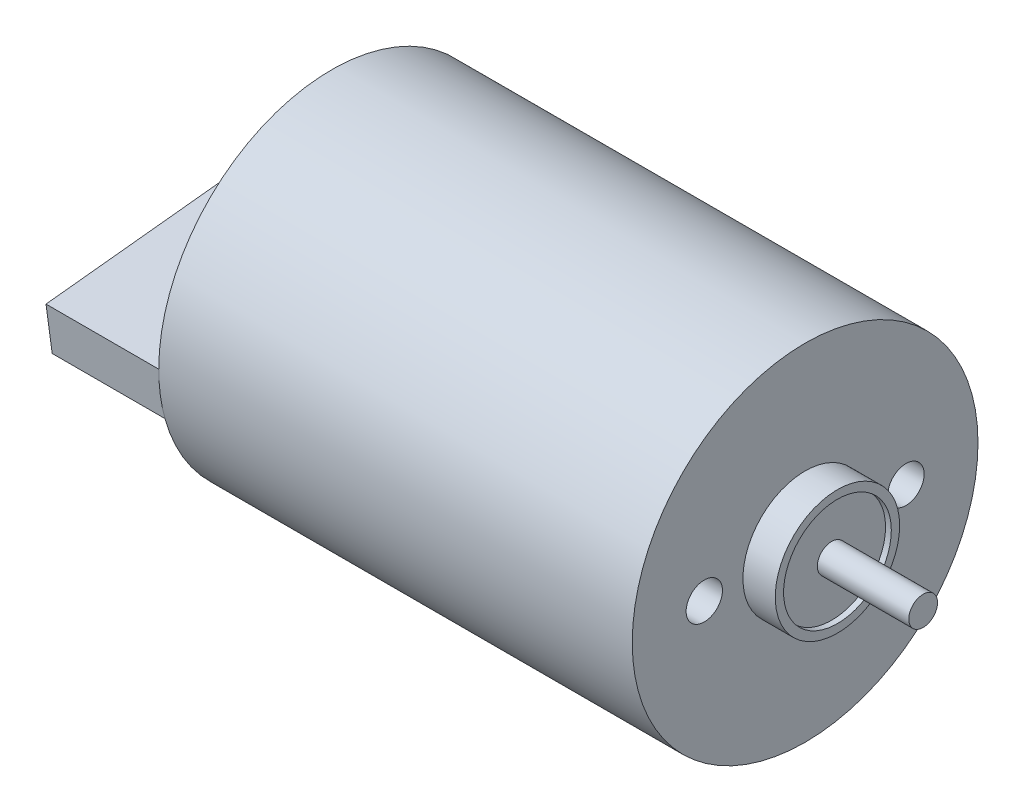
ISO-10303-21;
HEADER;
FILE_DESCRIPTION(('STEP AP214'),'2;1');
FILE_NAME('part.step','',(''),(''),'','','');
FILE_SCHEMA(('AUTOMOTIVE_DESIGN { 1 0 10303 214 1 1 1 1 }'));
ENDSEC;
DATA;
#1=APPLICATION_CONTEXT('core data for automotive mechanical design processes');
#2=APPLICATION_PROTOCOL_DEFINITION('international standard','automotive_design',2000,#1);
#3=PRODUCT_CONTEXT('',#1,'mechanical');
#4=PRODUCT('Part','Part','',(#3));
#5=PRODUCT_RELATED_PRODUCT_CATEGORY('part','',(#4));
#6=PRODUCT_DEFINITION_FORMATION('','',#4);
#7=PRODUCT_DEFINITION_CONTEXT('part definition',#1,'design');
#8=PRODUCT_DEFINITION('design','',#6,#7);
#9=PRODUCT_DEFINITION_SHAPE('','',#8);
#10=(LENGTH_UNIT() NAMED_UNIT(*) SI_UNIT(.MILLI.,.METRE.));
#11=(NAMED_UNIT(*) PLANE_ANGLE_UNIT() SI_UNIT($,.RADIAN.));
#12=(NAMED_UNIT(*) SI_UNIT($,.STERADIAN.) SOLID_ANGLE_UNIT());
#13=UNCERTAINTY_MEASURE_WITH_UNIT(LENGTH_MEASURE(1.E-05),#10,'distance_accuracy_value','');
#14=(GEOMETRIC_REPRESENTATION_CONTEXT(3) GLOBAL_UNCERTAINTY_ASSIGNED_CONTEXT((#13)) GLOBAL_UNIT_ASSIGNED_CONTEXT((#10,
#11,#12)) REPRESENTATION_CONTEXT('',''));
#15=CARTESIAN_POINT('',(0.,0.,0.));
#16=DIRECTION('',(0.,0.,1.));
#17=DIRECTION('',(1.,0.,0.));
#18=AXIS2_PLACEMENT_3D('',#15,#16,#17);
#19=CARTESIAN_POINT('',(0.,0.,0.));
#20=DIRECTION('',(1.,0.,0.));
#21=DIRECTION('',(0.,0.,-1.));
#22=AXIS2_PLACEMENT_3D('',#19,#20,#21);
#23=PLANE('',#22);
#24=DIRECTION('',(0.,-0.995275442929976,0.0970916716332595));
#25=VECTOR('',#24,1.);
#26=CARTESIAN_POINT('',(0.,-5.47362222950186,-12.6680487719579));
#27=LINE('',#26,#25);
#28=CARTESIAN_POINT('',(0.,2.92212281376711,-13.4870752300587));
#29=VERTEX_POINT('',#28);
#30=CARTESIAN_POINT('',(0.,-5.47362222950186,-12.6680487719579));
#31=VERTEX_POINT('',#30);
#32=EDGE_CURVE('E105',#29,#31,#27,.T.);
#33=ORIENTED_EDGE('',*,*,#32,.F.);
#34=CARTESIAN_POINT('',(0.,0.,0.));
#35=DIRECTION('',(1.,0.,0.));
#36=DIRECTION('',(0.,0.,-1.));
#37=AXIS2_PLACEMENT_3D('',#34,#35,#36);
#38=CIRCLE('',#37,13.8);
#39=EDGE_CURVE('E137',#31,#29,#38,.T.);
#40=ORIENTED_EDGE('',*,*,#39,.F.);
#41=EDGE_LOOP('',(#33,#40));
#42=FACE_BOUND('',#41,.T.);
#43=ADVANCED_FACE('F32',(#42),#23,.F.);
#44=DIRECTION('',(0.,0.106479359424172,-0.994314912900645));
#45=VECTOR('',#44,1.);
#46=CARTESIAN_POINT('',(0.,2.92212281376711,-13.4870752300587));
#47=LINE('',#46,#45);
#48=CARTESIAN_POINT('',(0.,0.,13.8));
#49=VERTEX_POINT('',#48);
#50=EDGE_CURVE('E55',#49,#29,#47,.T.);
#51=ORIENTED_EDGE('',*,*,#50,.F.);
#52=EDGE_CURVE('E36',#29,#49,#38,.T.);
#53=ORIENTED_EDGE('',*,*,#52,.F.);
#54=EDGE_LOOP('',(#51,#53));
#55=FACE_BOUND('',#54,.T.);
#56=ADVANCED_FACE('F176',(#55),#23,.F.);
#57=DIRECTION('',(0.,0.990972151755472,0.134067872531525));
#58=VECTOR('',#57,1.);
#59=CARTESIAN_POINT('',(0.,0.,13.8));
#60=LINE('',#59,#58);
#61=CARTESIAN_POINT('',(0.,-3.66686777621808,13.3039122333144));
#62=VERTEX_POINT('',#61);
#63=EDGE_CURVE('E151',#62,#49,#60,.T.);
#64=ORIENTED_EDGE('',*,*,#63,.F.);
#65=EDGE_CURVE('E142',#49,#62,#38,.T.);
#66=ORIENTED_EDGE('',*,*,#65,.F.);
#67=EDGE_LOOP('',(#64,#66));
#68=FACE_BOUND('',#67,.T.);
#69=ADVANCED_FACE('F152',(#68),#23,.F.);
#70=DIRECTION('',(0.,0.0693978587322014,0.997589062291375));
#71=VECTOR('',#70,1.);
#72=CARTESIAN_POINT('',(0.,-3.66686777621808,13.3039122333144));
#73=LINE('',#72,#71);
#74=EDGE_CURVE('E48',#31,#62,#73,.T.);
#75=ORIENTED_EDGE('',*,*,#74,.F.);
#76=EDGE_CURVE('E146',#62,#31,#38,.T.);
#77=ORIENTED_EDGE('',*,*,#76,.F.);
#78=EDGE_LOOP('',(#75,#77));
#79=FACE_BOUND('',#78,.T.);
#80=ADVANCED_FACE('F149',(#79),#23,.F.);
#81=CARTESIAN_POINT('',(37.8,0.,0.));
#82=DIRECTION('',(-1.,0.,0.));
#83=DIRECTION('',(0.,0.,1.));
#84=AXIS2_PLACEMENT_3D('',#81,#82,#83);
#85=CYLINDRICAL_SURFACE('',#84,13.8);
#86=CARTESIAN_POINT('',(37.8,0.,0.));
#87=DIRECTION('',(1.,0.,0.));
#88=DIRECTION('',(0.,0.,-1.));
#89=AXIS2_PLACEMENT_3D('',#86,#87,#88);
#90=CIRCLE('',#89,13.8);
#91=CARTESIAN_POINT('',(37.8,0.,-13.8));
#92=VERTEX_POINT('',#91);
#93=EDGE_CURVE('E41',#92,#92,#90,.T.);
#94=ORIENTED_EDGE('',*,*,#93,.F.);
#95=EDGE_LOOP('',(#94));
#96=FACE_BOUND('',#95,.T.);
#97=ORIENTED_EDGE('',*,*,#52,.T.);
#98=ORIENTED_EDGE('',*,*,#65,.T.);
#99=ORIENTED_EDGE('',*,*,#76,.T.);
#100=ORIENTED_EDGE('',*,*,#39,.T.);
#101=EDGE_LOOP('',(#97,#98,#99,#100));
#102=FACE_BOUND('',#101,.T.);
#103=ADVANCED_FACE('F34',(#96,#102),#85,.T.);
#104=CARTESIAN_POINT('',(37.8,0.,0.));
#105=DIRECTION('',(1.,0.,0.));
#106=DIRECTION('',(0.,0.,-1.));
#107=AXIS2_PLACEMENT_3D('',#104,#105,#106);
#108=PLANE('',#107);
#109=CARTESIAN_POINT('',(37.8,0.,8.05));
#110=DIRECTION('',(1.,0.,0.));
#111=DIRECTION('',(0.,0.,-1.));
#112=AXIS2_PLACEMENT_3D('',#109,#110,#111);
#113=CIRCLE('',#112,1.44999999999999);
#114=CARTESIAN_POINT('',(37.8,0.,6.60000000000001));
#115=VERTEX_POINT('',#114);
#116=EDGE_CURVE('E106',#115,#115,#113,.T.);
#117=ORIENTED_EDGE('',*,*,#116,.F.);
#118=EDGE_LOOP('',(#117));
#119=FACE_BOUND('',#118,.T.);
#120=CARTESIAN_POINT('',(37.8,0.,-8.05));
#121=DIRECTION('',(1.,0.,0.));
#122=DIRECTION('',(0.,0.,-1.));
#123=AXIS2_PLACEMENT_3D('',#120,#121,#122);
#124=CIRCLE('',#123,1.44999999999999);
#125=CARTESIAN_POINT('',(37.8,0.,-9.49999999999999));
#126=VERTEX_POINT('',#125);
#127=EDGE_CURVE('E117',#126,#126,#124,.T.);
#128=ORIENTED_EDGE('',*,*,#127,.F.);
#129=EDGE_LOOP('',(#128));
#130=FACE_BOUND('',#129,.T.);
#131=CARTESIAN_POINT('',(37.8,0.,0.));
#132=DIRECTION('',(1.,0.,0.));
#133=DIRECTION('',(0.,0.,-1.));
#134=AXIS2_PLACEMENT_3D('',#131,#132,#133);
#135=CIRCLE('',#134,4.965);
#136=CARTESIAN_POINT('',(37.8,0.,-4.965));
#137=VERTEX_POINT('',#136);
#138=EDGE_CURVE('E11',#137,#137,#135,.T.);
#139=ORIENTED_EDGE('',*,*,#138,.F.);
#140=EDGE_LOOP('',(#139));
#141=FACE_BOUND('',#140,.T.);
#142=ORIENTED_EDGE('',*,*,#93,.T.);
#143=EDGE_LOOP('',(#142));
#144=FACE_BOUND('',#143,.T.);
#145=ADVANCED_FACE('F187',(#119,#130,#141,#144),#108,.T.);
#146=CARTESIAN_POINT('',(40.38,0.,0.));
#147=DIRECTION('',(-1.,0.,0.));
#148=DIRECTION('',(0.,0.,1.));
#149=AXIS2_PLACEMENT_3D('',#146,#147,#148);
#150=CYLINDRICAL_SURFACE('',#149,4.965);
#151=CARTESIAN_POINT('',(40.38,0.,0.));
#152=DIRECTION('',(1.,0.,0.));
#153=DIRECTION('',(0.,0.,-1.));
#154=AXIS2_PLACEMENT_3D('',#151,#152,#153);
#155=CIRCLE('',#154,4.965);
#156=CARTESIAN_POINT('',(40.38,0.,-4.965));
#157=VERTEX_POINT('',#156);
#158=EDGE_CURVE('E133',#157,#157,#155,.T.);
#159=ORIENTED_EDGE('',*,*,#158,.F.);
#160=EDGE_LOOP('',(#159));
#161=FACE_BOUND('',#160,.T.);
#162=ORIENTED_EDGE('',*,*,#138,.T.);
#163=EDGE_LOOP('',(#162));
#164=FACE_BOUND('',#163,.T.);
#165=ADVANCED_FACE('F254',(#161,#164),#150,.T.);
#166=CARTESIAN_POINT('',(40.38,0.,0.));
#167=DIRECTION('',(1.,0.,0.));
#168=DIRECTION('',(0.,0.,-1.));
#169=AXIS2_PLACEMENT_3D('',#166,#167,#168);
#170=PLANE('',#169);
#171=CARTESIAN_POINT('',(40.38,0.,0.));
#172=DIRECTION('',(1.,0.,0.));
#173=DIRECTION('',(0.,0.,-1.));
#174=AXIS2_PLACEMENT_3D('',#171,#172,#173);
#175=CIRCLE('',#174,4.3);
#176=CARTESIAN_POINT('',(40.38,0.,-4.3));
#177=VERTEX_POINT('',#176);
#178=EDGE_CURVE('E127',#177,#177,#175,.T.);
#179=ORIENTED_EDGE('',*,*,#178,.F.);
#180=EDGE_LOOP('',(#179));
#181=FACE_BOUND('',#180,.T.);
#182=ORIENTED_EDGE('',*,*,#158,.T.);
#183=EDGE_LOOP('',(#182));
#184=FACE_BOUND('',#183,.T.);
#185=ADVANCED_FACE('F294',(#181,#184),#170,.T.);
#186=CARTESIAN_POINT('',(39.92,0.,0.));
#187=DIRECTION('',(1.,0.,0.));
#188=DIRECTION('',(0.,0.,-1.));
#189=AXIS2_PLACEMENT_3D('',#186,#187,#188);
#190=CYLINDRICAL_SURFACE('',#189,4.3);
#191=CARTESIAN_POINT('',(39.92,0.,0.));
#192=DIRECTION('',(1.,0.,0.));
#193=DIRECTION('',(0.,0.,-1.));
#194=AXIS2_PLACEMENT_3D('',#191,#192,#193);
#195=CIRCLE('',#194,4.3);
#196=CARTESIAN_POINT('',(39.92,0.,-4.3));
#197=VERTEX_POINT('',#196);
#198=EDGE_CURVE('E130',#197,#197,#195,.T.);
#199=ORIENTED_EDGE('',*,*,#198,.F.);
#200=EDGE_LOOP('',(#199));
#201=FACE_BOUND('',#200,.T.);
#202=ORIENTED_EDGE('',*,*,#178,.T.);
#203=EDGE_LOOP('',(#202));
#204=FACE_BOUND('',#203,.T.);
#205=ADVANCED_FACE('F284',(#201,#204),#190,.F.);
#206=CARTESIAN_POINT('',(39.92,0.,0.));
#207=DIRECTION('',(1.,0.,0.));
#208=DIRECTION('',(0.,0.,-1.));
#209=AXIS2_PLACEMENT_3D('',#206,#207,#208);
#210=PLANE('',#209);
#211=CARTESIAN_POINT('',(39.92,0.,0.));
#212=DIRECTION('',(1.,0.,0.));
#213=DIRECTION('',(0.,0.,-1.));
#214=AXIS2_PLACEMENT_3D('',#211,#212,#213);
#215=CIRCLE('',#214,1.15);
#216=CARTESIAN_POINT('',(39.92,0.,-1.15));
#217=VERTEX_POINT('',#216);
#218=EDGE_CURVE('E123',#217,#217,#215,.T.);
#219=ORIENTED_EDGE('',*,*,#218,.F.);
#220=EDGE_LOOP('',(#219));
#221=FACE_BOUND('',#220,.T.);
#222=ORIENTED_EDGE('',*,*,#198,.T.);
#223=EDGE_LOOP('',(#222));
#224=FACE_BOUND('',#223,.T.);
#225=ADVANCED_FACE('F274',(#221,#224),#210,.T.);
#226=CARTESIAN_POINT('',(47.22,0.,0.));
#227=DIRECTION('',(-1.,0.,0.));
#228=DIRECTION('',(0.,0.,1.));
#229=AXIS2_PLACEMENT_3D('',#226,#227,#228);
#230=CYLINDRICAL_SURFACE('',#229,1.15);
#231=CARTESIAN_POINT('',(47.22,0.,0.));
#232=DIRECTION('',(1.,0.,0.));
#233=DIRECTION('',(0.,0.,-1.));
#234=AXIS2_PLACEMENT_3D('',#231,#232,#233);
#235=CIRCLE('',#234,1.15);
#236=CARTESIAN_POINT('',(47.22,0.,-1.15));
#237=VERTEX_POINT('',#236);
#238=EDGE_CURVE('E124',#237,#237,#235,.T.);
#239=ORIENTED_EDGE('',*,*,#238,.F.);
#240=EDGE_LOOP('',(#239));
#241=FACE_BOUND('',#240,.T.);
#242=ORIENTED_EDGE('',*,*,#218,.T.);
#243=EDGE_LOOP('',(#242));
#244=FACE_BOUND('',#243,.T.);
#245=ADVANCED_FACE('F264',(#241,#244),#230,.T.);
#246=CARTESIAN_POINT('',(47.22,0.,0.));
#247=DIRECTION('',(1.,0.,0.));
#248=DIRECTION('',(0.,0.,-1.));
#249=AXIS2_PLACEMENT_3D('',#246,#247,#248);
#250=PLANE('',#249);
#251=ORIENTED_EDGE('',*,*,#238,.T.);
#252=EDGE_LOOP('',(#251));
#253=FACE_BOUND('',#252,.T.);
#254=ADVANCED_FACE('F242',(#253),#250,.T.);
#255=CARTESIAN_POINT('',(27.8,0.,-8.05));
#256=DIRECTION('',(1.,0.,0.));
#257=DIRECTION('',(0.,0.,-1.));
#258=AXIS2_PLACEMENT_3D('',#255,#256,#257);
#259=CONICAL_SURFACE('',#258,1.44999999999999,1.02974425867665);
#260=CARTESIAN_POINT('',(26.92875210241,0.,-8.05));
#261=VERTEX_POINT('',#260);
#262=VERTEX_LOOP('',#261);
#263=FACE_BOUND('',#262,.T.);
#264=CARTESIAN_POINT('',(27.8,0.,-8.05));
#265=DIRECTION('',(1.,0.,0.));
#266=DIRECTION('',(0.,0.,-1.));
#267=AXIS2_PLACEMENT_3D('',#264,#265,#266);
#268=CIRCLE('',#267,1.44999999999999);
#269=CARTESIAN_POINT('',(27.8,0.,-9.49999999999999));
#270=VERTEX_POINT('',#269);
#271=EDGE_CURVE('E120',#270,#270,#268,.T.);
#272=ORIENTED_EDGE('',*,*,#271,.T.);
#273=EDGE_LOOP('',(#272));
#274=FACE_BOUND('',#273,.T.);
#275=ADVANCED_FACE('F232',(#263,#274),#259,.F.);
#276=CARTESIAN_POINT('',(37.8,0.,-8.05));
#277=DIRECTION('',(1.,0.,0.));
#278=DIRECTION('',(0.,0.,-1.));
#279=AXIS2_PLACEMENT_3D('',#276,#277,#278);
#280=CYLINDRICAL_SURFACE('',#279,1.44999999999999);
#281=ORIENTED_EDGE('',*,*,#271,.F.);
#282=EDGE_LOOP('',(#281));
#283=FACE_BOUND('',#282,.T.);
#284=ORIENTED_EDGE('',*,*,#127,.T.);
#285=EDGE_LOOP('',(#284));
#286=FACE_BOUND('',#285,.T.);
#287=ADVANCED_FACE('F222',(#283,#286),#280,.F.);
#288=CARTESIAN_POINT('',(27.8,0.,8.05));
#289=DIRECTION('',(1.,0.,0.));
#290=DIRECTION('',(0.,0.,-1.));
#291=AXIS2_PLACEMENT_3D('',#288,#289,#290);
#292=CONICAL_SURFACE('',#291,1.44999999999999,1.02974425867665);
#293=CARTESIAN_POINT('',(26.92875210241,0.,8.05));
#294=VERTEX_POINT('',#293);
#295=VERTEX_LOOP('',#294);
#296=FACE_BOUND('',#295,.T.);
#297=CARTESIAN_POINT('',(27.8,0.,8.05));
#298=DIRECTION('',(1.,0.,0.));
#299=DIRECTION('',(0.,0.,-1.));
#300=AXIS2_PLACEMENT_3D('',#297,#298,#299);
#301=CIRCLE('',#300,1.44999999999999);
#302=CARTESIAN_POINT('',(27.8,0.,6.60000000000001));
#303=VERTEX_POINT('',#302);
#304=EDGE_CURVE('E109',#303,#303,#301,.T.);
#305=ORIENTED_EDGE('',*,*,#304,.T.);
#306=EDGE_LOOP('',(#305));
#307=FACE_BOUND('',#306,.T.);
#308=ADVANCED_FACE('F210',(#296,#307),#292,.F.);
#309=CARTESIAN_POINT('',(37.8,0.,8.05));
#310=DIRECTION('',(1.,0.,0.));
#311=DIRECTION('',(0.,0.,-1.));
#312=AXIS2_PLACEMENT_3D('',#309,#310,#311);
#313=CYLINDRICAL_SURFACE('',#312,1.44999999999999);
#314=ORIENTED_EDGE('',*,*,#304,.F.);
#315=EDGE_LOOP('',(#314));
#316=FACE_BOUND('',#315,.T.);
#317=ORIENTED_EDGE('',*,*,#116,.T.);
#318=EDGE_LOOP('',(#317));
#319=FACE_BOUND('',#318,.T.);
#320=ADVANCED_FACE('F205',(#316,#319),#313,.F.);
#321=CARTESIAN_POINT('',(-9.,-5.47362222950186,-12.6680487719579));
#322=DIRECTION('',(0.,0.0970916716332595,0.995275442929976));
#323=DIRECTION('',(0.,-0.995275442929976,0.0970916716332595));
#324=AXIS2_PLACEMENT_3D('',#321,#322,#323);
#325=PLANE('',#324);
#326=ORIENTED_EDGE('',*,*,#32,.T.);
#327=DIRECTION('',(1.,0.,0.));
#328=VECTOR('',#327,1.);
#329=CARTESIAN_POINT('',(-9.,-5.47362222950186,-12.6680487719579));
#330=LINE('',#329,#328);
#331=CARTESIAN_POINT('',(-9.,-5.47362222950186,-12.6680487719579));
#332=VERTEX_POINT('',#331);
#333=EDGE_CURVE('E87',#332,#31,#330,.T.);
#334=ORIENTED_EDGE('',*,*,#333,.F.);
#335=DIRECTION('',(0.,-0.995275442929976,0.0970916716332595));
#336=VECTOR('',#335,1.);
#337=CARTESIAN_POINT('',(-9.,-5.47362222950186,-12.6680487719579));
#338=LINE('',#337,#336);
#339=CARTESIAN_POINT('',(-9.,2.92212281376711,-13.4870752300587));
#340=VERTEX_POINT('',#339);
#341=EDGE_CURVE('E94',#340,#332,#338,.T.);
#342=ORIENTED_EDGE('',*,*,#341,.F.);
#343=DIRECTION('',(1.,0.,0.));
#344=VECTOR('',#343,1.);
#345=CARTESIAN_POINT('',(-9.,2.92212281376711,-13.4870752300587));
#346=LINE('',#345,#344);
#347=EDGE_CURVE('E160',#340,#29,#346,.T.);
#348=ORIENTED_EDGE('',*,*,#347,.T.);
#349=EDGE_LOOP('',(#326,#334,#342,#348));
#350=FACE_BOUND('',#349,.T.);
#351=ADVANCED_FACE('F104',(#350),#325,.F.);
#352=CARTESIAN_POINT('',(-9.,-3.66686777621808,13.3039122333144));
#353=DIRECTION('',(0.,0.997589062291375,-0.0693978587322014));
#354=DIRECTION('',(0.,0.0693978587322014,0.997589062291375));
#355=AXIS2_PLACEMENT_3D('',#352,#353,#354);
#356=PLANE('',#355);
#357=ORIENTED_EDGE('',*,*,#74,.T.);
#358=DIRECTION('',(1.,0.,0.));
#359=VECTOR('',#358,1.);
#360=CARTESIAN_POINT('',(-9.,-3.66686777621808,13.3039122333144));
#361=LINE('',#360,#359);
#362=CARTESIAN_POINT('',(-9.,-3.66686777621808,13.3039122333144));
#363=VERTEX_POINT('',#362);
#364=EDGE_CURVE('E90',#363,#62,#361,.T.);
#365=ORIENTED_EDGE('',*,*,#364,.F.);
#366=DIRECTION('',(0.,0.0693978587322014,0.997589062291375));
#367=VECTOR('',#366,1.);
#368=CARTESIAN_POINT('',(-9.,-3.66686777621808,13.3039122333144));
#369=LINE('',#368,#367);
#370=EDGE_CURVE('E83',#332,#363,#369,.T.);
#371=ORIENTED_EDGE('',*,*,#370,.F.);
#372=ORIENTED_EDGE('',*,*,#333,.T.);
#373=EDGE_LOOP('',(#357,#365,#371,#372));
#374=FACE_BOUND('',#373,.T.);
#375=ADVANCED_FACE('F85',(#374),#356,.F.);
#376=CARTESIAN_POINT('',(-9.,0.,13.8));
#377=DIRECTION('',(0.,0.134067872531525,-0.990972151755472));
#378=DIRECTION('',(0.,0.990972151755472,0.134067872531525));
#379=AXIS2_PLACEMENT_3D('',#376,#377,#378);
#380=PLANE('',#379);
#381=ORIENTED_EDGE('',*,*,#63,.T.);
#382=DIRECTION('',(1.,0.,0.));
#383=VECTOR('',#382,1.);
#384=CARTESIAN_POINT('',(-9.,0.,13.8));
#385=LINE('',#384,#383);
#386=CARTESIAN_POINT('',(-9.,0.,13.8));
#387=VERTEX_POINT('',#386);
#388=EDGE_CURVE('E111',#387,#49,#385,.T.);
#389=ORIENTED_EDGE('',*,*,#388,.F.);
#390=DIRECTION('',(0.,0.990972151755472,0.134067872531525));
#391=VECTOR('',#390,1.);
#392=CARTESIAN_POINT('',(-9.,0.,13.8));
#393=LINE('',#392,#391);
#394=EDGE_CURVE('E93',#363,#387,#393,.T.);
#395=ORIENTED_EDGE('',*,*,#394,.F.);
#396=ORIENTED_EDGE('',*,*,#364,.T.);
#397=EDGE_LOOP('',(#381,#389,#395,#396));
#398=FACE_BOUND('',#397,.T.);
#399=ADVANCED_FACE('F158',(#398),#380,.F.);
#400=CARTESIAN_POINT('',(-9.,2.92212281376711,-13.4870752300587));
#401=DIRECTION('',(0.,-0.994314912900645,-0.106479359424172));
#402=DIRECTION('',(0.,0.106479359424172,-0.994314912900646));
#403=AXIS2_PLACEMENT_3D('',#400,#401,#402);
#404=PLANE('',#403);
#405=ORIENTED_EDGE('',*,*,#50,.T.);
#406=ORIENTED_EDGE('',*,*,#347,.F.);
#407=DIRECTION('',(0.,0.106479359424172,-0.994314912900645));
#408=VECTOR('',#407,1.);
#409=CARTESIAN_POINT('',(-9.,2.92212281376711,-13.4870752300587));
#410=LINE('',#409,#408);
#411=EDGE_CURVE('E99',#387,#340,#410,.T.);
#412=ORIENTED_EDGE('',*,*,#411,.F.);
#413=ORIENTED_EDGE('',*,*,#388,.T.);
#414=EDGE_LOOP('',(#405,#406,#412,#413));
#415=FACE_BOUND('',#414,.T.);
#416=ADVANCED_FACE('F166',(#415),#404,.F.);
#417=CARTESIAN_POINT('',(-9.,0.,0.));
#418=DIRECTION('',(-1.,0.,0.));
#419=DIRECTION('',(0.,0.,1.));
#420=AXIS2_PLACEMENT_3D('',#417,#418,#419);
#421=PLANE('',#420);
#422=ORIENTED_EDGE('',*,*,#341,.T.);
#423=ORIENTED_EDGE('',*,*,#370,.T.);
#424=ORIENTED_EDGE('',*,*,#394,.T.);
#425=ORIENTED_EDGE('',*,*,#411,.T.);
#426=EDGE_LOOP('',(#422,#423,#424,#425));
#427=FACE_BOUND('',#426,.T.);
#428=ADVANCED_FACE('F97',(#427),#421,.T.);
#429=CLOSED_SHELL('',(#43,#56,#69,#80,#103,#145,#165,#185,#205,#225,#245,#254,#275,#287,#308,
#320,#351,#375,#399,#416,#428));
#430=MANIFOLD_SOLID_BREP('B2',#429);
#431=ADVANCED_BREP_SHAPE_REPRESENTATION('',(#18,#430),#14);
#432=SHAPE_DEFINITION_REPRESENTATION(#9,#431);
ENDSEC;
END-ISO-10303-21;
